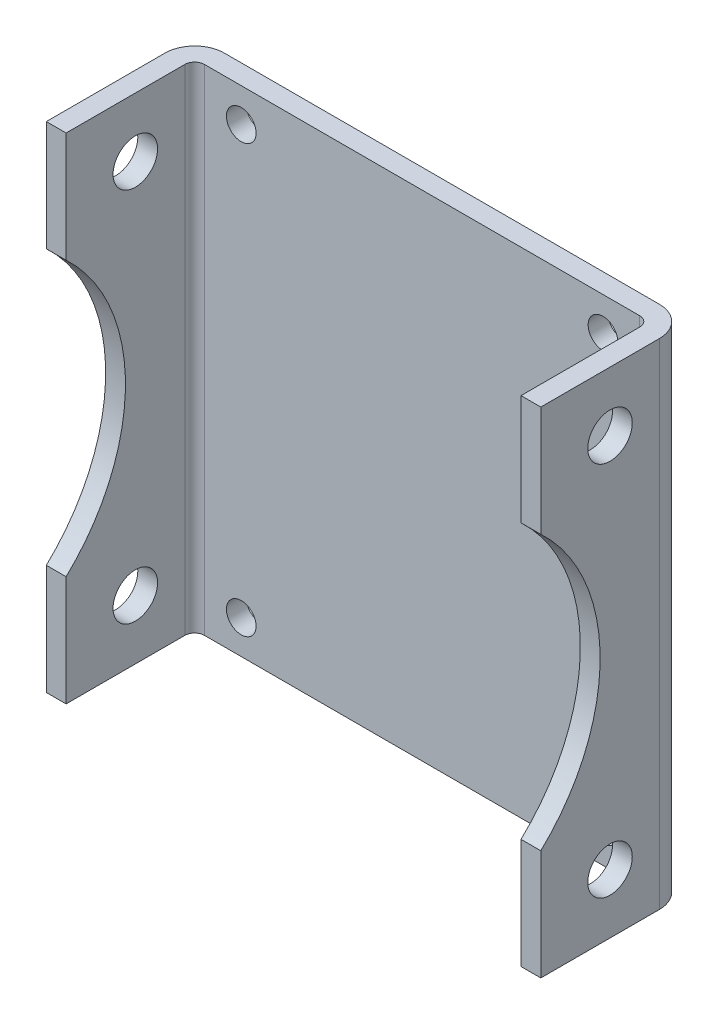
ISO-10303-21;
HEADER;
FILE_DESCRIPTION(('STEP AP214'),'2;1');
FILE_NAME('part.step','',(''),(''),'','','');
FILE_SCHEMA(('AUTOMOTIVE_DESIGN { 1 0 10303 214 1 1 1 1 }'));
ENDSEC;
DATA;
#1=APPLICATION_CONTEXT('core data for automotive mechanical design processes');
#2=APPLICATION_PROTOCOL_DEFINITION('international standard','automotive_design',2000,#1);
#3=PRODUCT_CONTEXT('',#1,'mechanical');
#4=PRODUCT('Part','Part','',(#3));
#5=PRODUCT_RELATED_PRODUCT_CATEGORY('part','',(#4));
#6=PRODUCT_DEFINITION_FORMATION('','',#4);
#7=PRODUCT_DEFINITION_CONTEXT('part definition',#1,'design');
#8=PRODUCT_DEFINITION('design','',#6,#7);
#9=PRODUCT_DEFINITION_SHAPE('','',#8);
#10=(LENGTH_UNIT() NAMED_UNIT(*) SI_UNIT(.MILLI.,.METRE.));
#11=(NAMED_UNIT(*) PLANE_ANGLE_UNIT() SI_UNIT($,.RADIAN.));
#12=(NAMED_UNIT(*) SI_UNIT($,.STERADIAN.) SOLID_ANGLE_UNIT());
#13=UNCERTAINTY_MEASURE_WITH_UNIT(LENGTH_MEASURE(1.E-05),#10,'distance_accuracy_value','');
#14=(GEOMETRIC_REPRESENTATION_CONTEXT(3) GLOBAL_UNCERTAINTY_ASSIGNED_CONTEXT((#13)) GLOBAL_UNIT_ASSIGNED_CONTEXT((#10,
#11,#12)) REPRESENTATION_CONTEXT('',''));
#15=CARTESIAN_POINT('',(0.,0.,0.));
#16=DIRECTION('',(0.,0.,1.));
#17=DIRECTION('',(1.,0.,0.));
#18=AXIS2_PLACEMENT_3D('',#15,#16,#17);
#19=CARTESIAN_POINT('',(0.,50.,0.));
#20=DIRECTION('',(0.,0.,-1.));
#21=DIRECTION('',(-1.,0.,0.));
#22=AXIS2_PLACEMENT_3D('',#19,#20,#21);
#23=PLANE('',#22);
#24=DIRECTION('',(0.,-1.,0.));
#25=VECTOR('',#24,1.);
#26=CARTESIAN_POINT('',(-2.,50.,0.));
#27=LINE('',#26,#25);
#28=CARTESIAN_POINT('',(-2.,50.,0.));
#29=VERTEX_POINT('',#28);
#30=CARTESIAN_POINT('',(-2.,38.856406460551,0.));
#31=VERTEX_POINT('',#30);
#32=EDGE_CURVE('E162',#29,#31,#27,.T.);
#33=ORIENTED_EDGE('',*,*,#32,.T.);
#34=DIRECTION('',(1.,0.,0.));
#35=VECTOR('',#34,1.);
#36=CARTESIAN_POINT('',(-2.00000000000002,38.856406460551,0.));
#37=LINE('',#36,#35);
#38=CARTESIAN_POINT('',(0.,38.856406460551,0.));
#39=VERTEX_POINT('',#38);
#40=EDGE_CURVE('E55',#31,#39,#37,.T.);
#41=ORIENTED_EDGE('',*,*,#40,.T.);
#42=DIRECTION('',(0.,-1.,0.));
#43=VECTOR('',#42,1.);
#44=CARTESIAN_POINT('',(0.,50.,0.));
#45=LINE('',#44,#43);
#46=CARTESIAN_POINT('',(0.,50.,0.));
#47=VERTEX_POINT('',#46);
#48=EDGE_CURVE('E40',#47,#39,#45,.T.);
#49=ORIENTED_EDGE('',*,*,#48,.F.);
#50=DIRECTION('',(1.,0.,0.));
#51=VECTOR('',#50,1.);
#52=CARTESIAN_POINT('',(0.,50.,0.));
#53=LINE('',#52,#51);
#54=EDGE_CURVE('E241',#29,#47,#53,.T.);
#55=ORIENTED_EDGE('',*,*,#54,.F.);
#56=EDGE_LOOP('',(#33,#41,#49,#55));
#57=FACE_BOUND('',#56,.T.);
#58=ADVANCED_FACE('F32',(#57),#23,.F.);
#59=CARTESIAN_POINT('',(48.,50.,0.));
#60=DIRECTION('',(0.,0.,-1.));
#61=DIRECTION('',(-1.,0.,0.));
#62=AXIS2_PLACEMENT_3D('',#59,#60,#61);
#63=PLANE('',#62);
#64=DIRECTION('',(0.,-1.,0.));
#65=VECTOR('',#64,1.);
#66=CARTESIAN_POINT('',(46.,50.,0.));
#67=LINE('',#66,#65);
#68=CARTESIAN_POINT('',(46.,50.,0.));
#69=VERTEX_POINT('',#68);
#70=CARTESIAN_POINT('',(46.,38.856406460551,0.));
#71=VERTEX_POINT('',#70);
#72=EDGE_CURVE('E186',#69,#71,#67,.T.);
#73=ORIENTED_EDGE('',*,*,#72,.T.);
#74=DIRECTION('',(1.,0.,0.));
#75=VECTOR('',#74,1.);
#76=CARTESIAN_POINT('',(-2.00000000000002,38.856406460551,0.));
#77=LINE('',#76,#75);
#78=CARTESIAN_POINT('',(48.,38.856406460551,0.));
#79=VERTEX_POINT('',#78);
#80=EDGE_CURVE('E372',#71,#79,#77,.T.);
#81=ORIENTED_EDGE('',*,*,#80,.T.);
#82=DIRECTION('',(0.,-1.,0.));
#83=VECTOR('',#82,1.);
#84=CARTESIAN_POINT('',(48.,50.,0.));
#85=LINE('',#84,#83);
#86=CARTESIAN_POINT('',(48.,50.,0.));
#87=VERTEX_POINT('',#86);
#88=EDGE_CURVE('E182',#87,#79,#85,.T.);
#89=ORIENTED_EDGE('',*,*,#88,.F.);
#90=DIRECTION('',(1.,0.,0.));
#91=VECTOR('',#90,1.);
#92=CARTESIAN_POINT('',(48.,50.,0.));
#93=LINE('',#92,#91);
#94=EDGE_CURVE('E258',#69,#87,#93,.T.);
#95=ORIENTED_EDGE('',*,*,#94,.F.);
#96=EDGE_LOOP('',(#73,#81,#89,#95));
#97=FACE_BOUND('',#96,.T.);
#98=ADVANCED_FACE('F309',(#97),#63,.F.);
#99=CARTESIAN_POINT('',(0.,11.143593539449,0.));
#100=VERTEX_POINT('',#99);
#101=CARTESIAN_POINT('',(0.,0.,0.));
#102=VERTEX_POINT('',#101);
#103=EDGE_CURVE('E154',#100,#102,#45,.T.);
#104=ORIENTED_EDGE('',*,*,#103,.F.);
#105=DIRECTION('',(1.,0.,0.));
#106=VECTOR('',#105,1.);
#107=CARTESIAN_POINT('',(-2.00000000000002,11.143593539449,0.));
#108=LINE('',#107,#106);
#109=CARTESIAN_POINT('',(-2.00000000000002,11.143593539449,0.));
#110=VERTEX_POINT('',#109);
#111=EDGE_CURVE('E143',#100,#110,#108,.F.);
#112=ORIENTED_EDGE('',*,*,#111,.T.);
#113=CARTESIAN_POINT('',(-2.,0.,0.));
#114=VERTEX_POINT('',#113);
#115=EDGE_CURVE('E152',#110,#114,#27,.T.);
#116=ORIENTED_EDGE('',*,*,#115,.T.);
#117=DIRECTION('',(1.,0.,0.));
#118=VECTOR('',#117,1.);
#119=CARTESIAN_POINT('',(0.,0.,0.));
#120=LINE('',#119,#118);
#121=EDGE_CURVE('E210',#114,#102,#120,.T.);
#122=ORIENTED_EDGE('',*,*,#121,.T.);
#123=EDGE_LOOP('',(#104,#112,#116,#122));
#124=FACE_BOUND('',#123,.T.);
#125=ADVANCED_FACE('F34',(#124),#23,.F.);
#126=CARTESIAN_POINT('',(0.,50.,-12.));
#127=DIRECTION('',(-1.,0.,0.));
#128=DIRECTION('',(0.,0.,1.));
#129=AXIS2_PLACEMENT_3D('',#126,#127,#128);
#130=PLANE('',#129);
#131=CARTESIAN_POINT('',(0.,6.,-7.00000000000003));
#132=DIRECTION('',(-1.,0.,0.));
#133=DIRECTION('',(0.,0.,1.));
#134=AXIS2_PLACEMENT_3D('',#131,#132,#133);
#135=CIRCLE('',#134,2.25);
#136=CARTESIAN_POINT('',(0.,6.,-4.75000000000003));
#137=VERTEX_POINT('',#136);
#138=EDGE_CURVE('E214',#137,#137,#135,.T.);
#139=ORIENTED_EDGE('',*,*,#138,.T.);
#140=EDGE_LOOP('',(#139));
#141=FACE_BOUND('',#140,.T.);
#142=CARTESIAN_POINT('',(0.,44.,-7.00000000000002));
#143=DIRECTION('',(-1.,0.,0.));
#144=DIRECTION('',(0.,0.,1.));
#145=AXIS2_PLACEMENT_3D('',#142,#143,#144);
#146=CIRCLE('',#145,2.25);
#147=CARTESIAN_POINT('',(0.,44.,-4.75000000000002));
#148=VERTEX_POINT('',#147);
#149=EDGE_CURVE('E275',#148,#148,#146,.T.);
#150=ORIENTED_EDGE('',*,*,#149,.T.);
#151=EDGE_LOOP('',(#150));
#152=FACE_BOUND('',#151,.T.);
#153=ORIENTED_EDGE('',*,*,#48,.T.);
#154=CARTESIAN_POINT('',(0.,25.,13.));
#155=DIRECTION('',(-1.,0.,0.));
#156=DIRECTION('',(0.,0.,1.));
#157=AXIS2_PLACEMENT_3D('',#154,#155,#156);
#158=CIRCLE('',#157,19.);
#159=EDGE_CURVE('E155',#39,#100,#158,.T.);
#160=ORIENTED_EDGE('',*,*,#159,.T.);
#161=ORIENTED_EDGE('',*,*,#103,.T.);
#162=DIRECTION('',(0.,0.,-1.));
#163=VECTOR('',#162,1.);
#164=CARTESIAN_POINT('',(0.,0.,-12.));
#165=LINE('',#164,#163);
#166=CARTESIAN_POINT('',(0.,0.,-12.));
#167=VERTEX_POINT('',#166);
#168=EDGE_CURVE('E206',#102,#167,#165,.T.);
#169=ORIENTED_EDGE('',*,*,#168,.T.);
#170=DIRECTION('',(0.,-1.,0.));
#171=VECTOR('',#170,1.);
#172=CARTESIAN_POINT('',(0.,50.,-12.));
#173=LINE('',#172,#171);
#174=CARTESIAN_POINT('',(0.,50.,-12.));
#175=VERTEX_POINT('',#174);
#176=EDGE_CURVE('E198',#175,#167,#173,.T.);
#177=ORIENTED_EDGE('',*,*,#176,.F.);
#178=DIRECTION('',(0.,0.,-1.));
#179=VECTOR('',#178,1.);
#180=CARTESIAN_POINT('',(0.,50.,-12.));
#181=LINE('',#180,#179);
#182=EDGE_CURVE('E243',#47,#175,#181,.T.);
#183=ORIENTED_EDGE('',*,*,#182,.F.);
#184=EDGE_LOOP('',(#153,#160,#161,#169,#177,#183));
#185=FACE_BOUND('',#184,.T.);
#186=ADVANCED_FACE('F204',(#141,#152,#185),#130,.F.);
#187=CARTESIAN_POINT('',(1.,50.,-12.));
#188=DIRECTION('',(0.,-1.,0.));
#189=DIRECTION('',(0.,0.,-1.));
#190=AXIS2_PLACEMENT_3D('',#187,#188,#189);
#191=CYLINDRICAL_SURFACE('',#190,1.);
#192=CARTESIAN_POINT('',(1.,0.,-12.));
#193=DIRECTION('',(0.,-1.,0.));
#194=DIRECTION('',(0.,0.,1.));
#195=AXIS2_PLACEMENT_3D('',#192,#193,#194);
#196=CIRCLE('',#195,1.);
#197=CARTESIAN_POINT('',(1.,0.,-13.));
#198=VERTEX_POINT('',#197);
#199=EDGE_CURVE('E212',#167,#198,#196,.T.);
#200=ORIENTED_EDGE('',*,*,#199,.T.);
#201=DIRECTION('',(0.,-1.,0.));
#202=VECTOR('',#201,1.);
#203=CARTESIAN_POINT('',(1.,50.,-13.));
#204=LINE('',#203,#202);
#205=CARTESIAN_POINT('',(1.,50.,-13.));
#206=VERTEX_POINT('',#205);
#207=EDGE_CURVE('E195',#206,#198,#204,.T.);
#208=ORIENTED_EDGE('',*,*,#207,.F.);
#209=CARTESIAN_POINT('',(1.,50.,-12.));
#210=DIRECTION('',(0.,-1.,0.));
#211=DIRECTION('',(0.,0.,1.));
#212=AXIS2_PLACEMENT_3D('',#209,#210,#211);
#213=CIRCLE('',#212,1.);
#214=EDGE_CURVE('E247',#175,#206,#213,.T.);
#215=ORIENTED_EDGE('',*,*,#214,.F.);
#216=ORIENTED_EDGE('',*,*,#176,.T.);
#217=EDGE_LOOP('',(#200,#208,#215,#216));
#218=FACE_BOUND('',#217,.T.);
#219=ADVANCED_FACE('F320',(#218),#191,.F.);
#220=CARTESIAN_POINT('',(45.,50.,-13.));
#221=DIRECTION('',(0.,0.,-1.));
#222=DIRECTION('',(-1.,0.,0.));
#223=AXIS2_PLACEMENT_3D('',#220,#221,#222);
#224=PLANE('',#223);
#225=CARTESIAN_POINT('',(41.29,3.41,-13.));
#226=DIRECTION('',(0.,0.,-1.));
#227=DIRECTION('',(-1.,0.,0.));
#228=AXIS2_PLACEMENT_3D('',#225,#226,#227);
#229=CIRCLE('',#228,1.5);
#230=CARTESIAN_POINT('',(39.79,3.41,-13.));
#231=VERTEX_POINT('',#230);
#232=EDGE_CURVE('E402',#231,#231,#229,.T.);
#233=ORIENTED_EDGE('',*,*,#232,.T.);
#234=EDGE_LOOP('',(#233));
#235=FACE_BOUND('',#234,.T.);
#236=CARTESIAN_POINT('',(4.71,3.41,-13.));
#237=DIRECTION('',(0.,0.,-1.));
#238=DIRECTION('',(-1.,0.,0.));
#239=AXIS2_PLACEMENT_3D('',#236,#237,#238);
#240=CIRCLE('',#239,1.5);
#241=CARTESIAN_POINT('',(3.21,3.41,-13.));
#242=VERTEX_POINT('',#241);
#243=EDGE_CURVE('E412',#242,#242,#240,.T.);
#244=ORIENTED_EDGE('',*,*,#243,.T.);
#245=EDGE_LOOP('',(#244));
#246=FACE_BOUND('',#245,.T.);
#247=CARTESIAN_POINT('',(4.71,46.59,-13.));
#248=DIRECTION('',(0.,0.,-1.));
#249=DIRECTION('',(-1.,0.,0.));
#250=AXIS2_PLACEMENT_3D('',#247,#248,#249);
#251=CIRCLE('',#250,1.5);
#252=CARTESIAN_POINT('',(3.21,46.59,-13.));
#253=VERTEX_POINT('',#252);
#254=EDGE_CURVE('E415',#253,#253,#251,.T.);
#255=ORIENTED_EDGE('',*,*,#254,.T.);
#256=EDGE_LOOP('',(#255));
#257=FACE_BOUND('',#256,.T.);
#258=CARTESIAN_POINT('',(41.29,46.59,-13.));
#259=DIRECTION('',(0.,0.,-1.));
#260=DIRECTION('',(-1.,0.,0.));
#261=AXIS2_PLACEMENT_3D('',#258,#259,#260);
#262=CIRCLE('',#261,1.5);
#263=CARTESIAN_POINT('',(39.79,46.59,-13.));
#264=VERTEX_POINT('',#263);
#265=EDGE_CURVE('E418',#264,#264,#262,.T.);
#266=ORIENTED_EDGE('',*,*,#265,.T.);
#267=EDGE_LOOP('',(#266));
#268=FACE_BOUND('',#267,.T.);
#269=DIRECTION('',(1.,0.,0.));
#270=VECTOR('',#269,1.);
#271=CARTESIAN_POINT('',(45.,0.,-13.));
#272=LINE('',#271,#270);
#273=CARTESIAN_POINT('',(45.,0.,-13.));
#274=VERTEX_POINT('',#273);
#275=EDGE_CURVE('E222',#198,#274,#272,.T.);
#276=ORIENTED_EDGE('',*,*,#275,.T.);
#277=DIRECTION('',(0.,-1.,0.));
#278=VECTOR('',#277,1.);
#279=CARTESIAN_POINT('',(45.,50.,-13.));
#280=LINE('',#279,#278);
#281=CARTESIAN_POINT('',(45.,50.,-13.));
#282=VERTEX_POINT('',#281);
#283=EDGE_CURVE('E192',#282,#274,#280,.T.);
#284=ORIENTED_EDGE('',*,*,#283,.F.);
#285=DIRECTION('',(1.,0.,0.));
#286=VECTOR('',#285,1.);
#287=CARTESIAN_POINT('',(45.,50.,-13.));
#288=LINE('',#287,#286);
#289=EDGE_CURVE('E252',#206,#282,#288,.T.);
#290=ORIENTED_EDGE('',*,*,#289,.F.);
#291=ORIENTED_EDGE('',*,*,#207,.T.);
#292=EDGE_LOOP('',(#276,#284,#290,#291));
#293=FACE_BOUND('',#292,.T.);
#294=ADVANCED_FACE('F325',(#235,#246,#257,#268,#293),#224,.F.);
#295=CARTESIAN_POINT('',(45.,50.,-12.));
#296=DIRECTION('',(0.,-1.,0.));
#297=DIRECTION('',(0.,0.,-1.));
#298=AXIS2_PLACEMENT_3D('',#295,#296,#297);
#299=CYLINDRICAL_SURFACE('',#298,1.);
#300=CARTESIAN_POINT('',(45.,0.,-12.));
#301=DIRECTION('',(0.,-1.,0.));
#302=DIRECTION('',(0.,0.,1.));
#303=AXIS2_PLACEMENT_3D('',#300,#301,#302);
#304=CIRCLE('',#303,1.);
#305=CARTESIAN_POINT('',(46.,0.,-12.));
#306=VERTEX_POINT('',#305);
#307=EDGE_CURVE('E224',#274,#306,#304,.T.);
#308=ORIENTED_EDGE('',*,*,#307,.T.);
#309=DIRECTION('',(0.,-1.,0.));
#310=VECTOR('',#309,1.);
#311=CARTESIAN_POINT('',(46.,50.,-12.));
#312=LINE('',#311,#310);
#313=CARTESIAN_POINT('',(46.,50.,-12.));
#314=VERTEX_POINT('',#313);
#315=EDGE_CURVE('E189',#314,#306,#312,.T.);
#316=ORIENTED_EDGE('',*,*,#315,.F.);
#317=CARTESIAN_POINT('',(45.,50.,-12.));
#318=DIRECTION('',(0.,-1.,0.));
#319=DIRECTION('',(0.,0.,1.));
#320=AXIS2_PLACEMENT_3D('',#317,#318,#319);
#321=CIRCLE('',#320,1.);
#322=EDGE_CURVE('E254',#282,#314,#321,.T.);
#323=ORIENTED_EDGE('',*,*,#322,.F.);
#324=ORIENTED_EDGE('',*,*,#283,.T.);
#325=EDGE_LOOP('',(#308,#316,#323,#324));
#326=FACE_BOUND('',#325,.T.);
#327=ADVANCED_FACE('F332',(#326),#299,.F.);
#328=CARTESIAN_POINT('',(46.,50.,0.));
#329=DIRECTION('',(1.,0.,0.));
#330=DIRECTION('',(0.,0.,-1.));
#331=AXIS2_PLACEMENT_3D('',#328,#329,#330);
#332=PLANE('',#331);
#333=CARTESIAN_POINT('',(46.,6.,-7.));
#334=DIRECTION('',(1.,0.,0.));
#335=DIRECTION('',(0.,0.,-1.));
#336=AXIS2_PLACEMENT_3D('',#333,#334,#335);
#337=CIRCLE('',#336,2.25);
#338=CARTESIAN_POINT('',(46.,6.,-9.25000000000001));
#339=VERTEX_POINT('',#338);
#340=EDGE_CURVE('E217',#339,#339,#337,.T.);
#341=ORIENTED_EDGE('',*,*,#340,.T.);
#342=EDGE_LOOP('',(#341));
#343=FACE_BOUND('',#342,.T.);
#344=CARTESIAN_POINT('',(46.,44.,-7.));
#345=DIRECTION('',(1.,0.,0.));
#346=DIRECTION('',(0.,0.,-1.));
#347=AXIS2_PLACEMENT_3D('',#344,#345,#346);
#348=CIRCLE('',#347,2.25);
#349=CARTESIAN_POINT('',(46.,44.,-9.25));
#350=VERTEX_POINT('',#349);
#351=EDGE_CURVE('E272',#350,#350,#348,.T.);
#352=ORIENTED_EDGE('',*,*,#351,.T.);
#353=EDGE_LOOP('',(#352));
#354=FACE_BOUND('',#353,.T.);
#355=CARTESIAN_POINT('',(46.,11.143593539449,0.));
#356=VERTEX_POINT('',#355);
#357=CARTESIAN_POINT('',(46.,0.,0.));
#358=VERTEX_POINT('',#357);
#359=EDGE_CURVE('E185',#356,#358,#67,.T.);
#360=ORIENTED_EDGE('',*,*,#359,.F.);
#361=CARTESIAN_POINT('',(46.,25.,13.));
#362=DIRECTION('',(1.,0.,0.));
#363=DIRECTION('',(0.,0.,-1.));
#364=AXIS2_PLACEMENT_3D('',#361,#362,#363);
#365=CIRCLE('',#364,19.);
#366=EDGE_CURVE('E370',#356,#71,#365,.T.);
#367=ORIENTED_EDGE('',*,*,#366,.T.);
#368=ORIENTED_EDGE('',*,*,#72,.F.);
#369=DIRECTION('',(0.,0.,1.));
#370=VECTOR('',#369,1.);
#371=CARTESIAN_POINT('',(46.,50.,0.));
#372=LINE('',#371,#370);
#373=EDGE_CURVE('E256',#314,#69,#372,.T.);
#374=ORIENTED_EDGE('',*,*,#373,.F.);
#375=ORIENTED_EDGE('',*,*,#315,.T.);
#376=DIRECTION('',(0.,0.,1.));
#377=VECTOR('',#376,1.);
#378=CARTESIAN_POINT('',(46.,0.,0.));
#379=LINE('',#378,#377);
#380=EDGE_CURVE('E226',#306,#358,#379,.T.);
#381=ORIENTED_EDGE('',*,*,#380,.T.);
#382=EDGE_LOOP('',(#360,#367,#368,#374,#375,#381));
#383=FACE_BOUND('',#382,.T.);
#384=ADVANCED_FACE('F283',(#343,#354,#383),#332,.F.);
#385=CARTESIAN_POINT('',(48.,11.143593539449,0.));
#386=VERTEX_POINT('',#385);
#387=CARTESIAN_POINT('',(48.,0.,0.));
#388=VERTEX_POINT('',#387);
#389=EDGE_CURVE('E181',#386,#388,#85,.T.);
#390=ORIENTED_EDGE('',*,*,#389,.F.);
#391=DIRECTION('',(1.,0.,0.));
#392=VECTOR('',#391,1.);
#393=CARTESIAN_POINT('',(-2.00000000000002,11.143593539449,0.));
#394=LINE('',#393,#392);
#395=EDGE_CURVE('E47',#386,#356,#394,.F.);
#396=ORIENTED_EDGE('',*,*,#395,.T.);
#397=ORIENTED_EDGE('',*,*,#359,.T.);
#398=DIRECTION('',(1.,0.,0.));
#399=VECTOR('',#398,1.);
#400=CARTESIAN_POINT('',(48.,0.,0.));
#401=LINE('',#400,#399);
#402=EDGE_CURVE('E229',#358,#388,#401,.T.);
#403=ORIENTED_EDGE('',*,*,#402,.T.);
#404=EDGE_LOOP('',(#390,#396,#397,#403));
#405=FACE_BOUND('',#404,.T.);
#406=ADVANCED_FACE('F315',(#405),#63,.F.);
#407=CARTESIAN_POINT('',(48.,50.,-12.));
#408=DIRECTION('',(-1.,0.,0.));
#409=DIRECTION('',(0.,0.,1.));
#410=AXIS2_PLACEMENT_3D('',#407,#408,#409);
#411=PLANE('',#410);
#412=CARTESIAN_POINT('',(48.,6.,-7.));
#413=DIRECTION('',(1.,0.,0.));
#414=DIRECTION('',(0.,0.,-1.));
#415=AXIS2_PLACEMENT_3D('',#412,#413,#414);
#416=CIRCLE('',#415,2.25);
#417=CARTESIAN_POINT('',(48.,6.,-9.25));
#418=VERTEX_POINT('',#417);
#419=EDGE_CURVE('E399',#418,#418,#416,.T.);
#420=ORIENTED_EDGE('',*,*,#419,.F.);
#421=EDGE_LOOP('',(#420));
#422=FACE_BOUND('',#421,.T.);
#423=CARTESIAN_POINT('',(48.,44.,-7.));
#424=DIRECTION('',(1.,0.,0.));
#425=DIRECTION('',(0.,0.,-1.));
#426=AXIS2_PLACEMENT_3D('',#423,#424,#425);
#427=CIRCLE('',#426,2.25);
#428=CARTESIAN_POINT('',(48.,44.,-9.25));
#429=VERTEX_POINT('',#428);
#430=EDGE_CURVE('E405',#429,#429,#427,.T.);
#431=ORIENTED_EDGE('',*,*,#430,.F.);
#432=EDGE_LOOP('',(#431));
#433=FACE_BOUND('',#432,.T.);
#434=ORIENTED_EDGE('',*,*,#88,.T.);
#435=CARTESIAN_POINT('',(48.,25.,13.));
#436=DIRECTION('',(1.,0.,0.));
#437=DIRECTION('',(0.,0.,-1.));
#438=AXIS2_PLACEMENT_3D('',#435,#436,#437);
#439=CIRCLE('',#438,19.);
#440=EDGE_CURVE('E378',#386,#79,#439,.T.);
#441=ORIENTED_EDGE('',*,*,#440,.F.);
#442=ORIENTED_EDGE('',*,*,#389,.T.);
#443=DIRECTION('',(0.,0.,-1.));
#444=VECTOR('',#443,1.);
#445=CARTESIAN_POINT('',(48.,0.,-12.));
#446=LINE('',#445,#444);
#447=CARTESIAN_POINT('',(48.,0.,-12.));
#448=VERTEX_POINT('',#447);
#449=EDGE_CURVE('E232',#388,#448,#446,.T.);
#450=ORIENTED_EDGE('',*,*,#449,.T.);
#451=DIRECTION('',(0.,-1.,0.));
#452=VECTOR('',#451,1.);
#453=CARTESIAN_POINT('',(48.,50.,-12.));
#454=LINE('',#453,#452);
#455=CARTESIAN_POINT('',(48.,50.,-12.));
#456=VERTEX_POINT('',#455);
#457=EDGE_CURVE('E178',#456,#448,#454,.T.);
#458=ORIENTED_EDGE('',*,*,#457,.F.);
#459=DIRECTION('',(0.,0.,-1.));
#460=VECTOR('',#459,1.);
#461=CARTESIAN_POINT('',(48.,50.,-12.));
#462=LINE('',#461,#460);
#463=EDGE_CURVE('E260',#87,#456,#462,.T.);
#464=ORIENTED_EDGE('',*,*,#463,.F.);
#465=EDGE_LOOP('',(#434,#441,#442,#450,#458,#464));
#466=FACE_BOUND('',#465,.T.);
#467=ADVANCED_FACE('F340',(#422,#433,#466),#411,.F.);
#468=CARTESIAN_POINT('',(45.,50.,-12.));
#469=DIRECTION('',(0.,-1.,0.));
#470=DIRECTION('',(0.,0.,-1.));
#471=AXIS2_PLACEMENT_3D('',#468,#469,#470);
#472=CYLINDRICAL_SURFACE('',#471,3.);
#473=CARTESIAN_POINT('',(45.,0.,-12.));
#474=DIRECTION('',(0.,1.,0.));
#475=DIRECTION('',(0.,0.,-1.));
#476=AXIS2_PLACEMENT_3D('',#473,#474,#475);
#477=CIRCLE('',#476,3.);
#478=CARTESIAN_POINT('',(45.,0.,-15.));
#479=VERTEX_POINT('',#478);
#480=EDGE_CURVE('E234',#448,#479,#477,.T.);
#481=ORIENTED_EDGE('',*,*,#480,.T.);
#482=DIRECTION('',(0.,-1.,0.));
#483=VECTOR('',#482,1.);
#484=CARTESIAN_POINT('',(45.,50.,-15.));
#485=LINE('',#484,#483);
#486=CARTESIAN_POINT('',(45.,50.,-15.));
#487=VERTEX_POINT('',#486);
#488=EDGE_CURVE('E175',#487,#479,#485,.T.);
#489=ORIENTED_EDGE('',*,*,#488,.F.);
#490=CARTESIAN_POINT('',(45.,50.,-12.));
#491=DIRECTION('',(0.,1.,0.));
#492=DIRECTION('',(0.,0.,-1.));
#493=AXIS2_PLACEMENT_3D('',#490,#491,#492);
#494=CIRCLE('',#493,3.);
#495=EDGE_CURVE('E262',#456,#487,#494,.T.);
#496=ORIENTED_EDGE('',*,*,#495,.F.);
#497=ORIENTED_EDGE('',*,*,#457,.T.);
#498=EDGE_LOOP('',(#481,#489,#496,#497));
#499=FACE_BOUND('',#498,.T.);
#500=ADVANCED_FACE('F344',(#499),#472,.T.);
#501=CARTESIAN_POINT('',(0.999999999999999,50.,-15.));
#502=DIRECTION('',(0.,0.,1.));
#503=DIRECTION('',(1.,0.,0.));
#504=AXIS2_PLACEMENT_3D('',#501,#502,#503);
#505=PLANE('',#504);
#506=CARTESIAN_POINT('',(41.29,3.41,-15.));
#507=DIRECTION('',(0.,0.,-1.));
#508=DIRECTION('',(-1.,0.,0.));
#509=AXIS2_PLACEMENT_3D('',#506,#507,#508);
#510=CIRCLE('',#509,1.5);
#511=CARTESIAN_POINT('',(39.79,3.41,-15.));
#512=VERTEX_POINT('',#511);
#513=EDGE_CURVE('E425',#512,#512,#510,.T.);
#514=ORIENTED_EDGE('',*,*,#513,.F.);
#515=EDGE_LOOP('',(#514));
#516=FACE_BOUND('',#515,.T.);
#517=CARTESIAN_POINT('',(4.71,3.41,-15.));
#518=DIRECTION('',(0.,0.,-1.));
#519=DIRECTION('',(-1.,0.,0.));
#520=AXIS2_PLACEMENT_3D('',#517,#518,#519);
#521=CIRCLE('',#520,1.5);
#522=CARTESIAN_POINT('',(3.21,3.41,-15.));
#523=VERTEX_POINT('',#522);
#524=EDGE_CURVE('E428',#523,#523,#521,.T.);
#525=ORIENTED_EDGE('',*,*,#524,.F.);
#526=EDGE_LOOP('',(#525));
#527=FACE_BOUND('',#526,.T.);
#528=CARTESIAN_POINT('',(4.71,46.59,-15.));
#529=DIRECTION('',(0.,0.,-1.));
#530=DIRECTION('',(-1.,0.,0.));
#531=AXIS2_PLACEMENT_3D('',#528,#529,#530);
#532=CIRCLE('',#531,1.5);
#533=CARTESIAN_POINT('',(3.21,46.59,-15.));
#534=VERTEX_POINT('',#533);
#535=EDGE_CURVE('E424',#534,#534,#532,.T.);
#536=ORIENTED_EDGE('',*,*,#535,.F.);
#537=EDGE_LOOP('',(#536));
#538=FACE_BOUND('',#537,.T.);
#539=CARTESIAN_POINT('',(41.29,46.59,-15.));
#540=DIRECTION('',(0.,0.,-1.));
#541=DIRECTION('',(-1.,0.,0.));
#542=AXIS2_PLACEMENT_3D('',#539,#540,#541);
#543=CIRCLE('',#542,1.5);
#544=CARTESIAN_POINT('',(39.79,46.59,-15.));
#545=VERTEX_POINT('',#544);
#546=EDGE_CURVE('E421',#545,#545,#543,.T.);
#547=ORIENTED_EDGE('',*,*,#546,.F.);
#548=EDGE_LOOP('',(#547));
#549=FACE_BOUND('',#548,.T.);
#550=DIRECTION('',(-1.,0.,0.));
#551=VECTOR('',#550,1.);
#552=CARTESIAN_POINT('',(0.999999999999999,0.,-15.));
#553=LINE('',#552,#551);
#554=CARTESIAN_POINT('',(0.999999999999999,0.,-15.));
#555=VERTEX_POINT('',#554);
#556=EDGE_CURVE('E236',#479,#555,#553,.T.);
#557=ORIENTED_EDGE('',*,*,#556,.T.);
#558=DIRECTION('',(0.,-1.,0.));
#559=VECTOR('',#558,1.);
#560=CARTESIAN_POINT('',(0.999999999999999,50.,-15.));
#561=LINE('',#560,#559);
#562=CARTESIAN_POINT('',(0.999999999999999,50.,-15.));
#563=VERTEX_POINT('',#562);
#564=EDGE_CURVE('E172',#563,#555,#561,.T.);
#565=ORIENTED_EDGE('',*,*,#564,.F.);
#566=DIRECTION('',(-1.,0.,0.));
#567=VECTOR('',#566,1.);
#568=CARTESIAN_POINT('',(0.999999999999999,50.,-15.));
#569=LINE('',#568,#567);
#570=EDGE_CURVE('E264',#487,#563,#569,.T.);
#571=ORIENTED_EDGE('',*,*,#570,.F.);
#572=ORIENTED_EDGE('',*,*,#488,.T.);
#573=EDGE_LOOP('',(#557,#565,#571,#572));
#574=FACE_BOUND('',#573,.T.);
#575=ADVANCED_FACE('F348',(#516,#527,#538,#549,#574),#505,.F.);
#576=CARTESIAN_POINT('',(0.999999999999999,50.,-12.));
#577=DIRECTION('',(0.,-1.,0.));
#578=DIRECTION('',(0.,0.,-1.));
#579=AXIS2_PLACEMENT_3D('',#576,#577,#578);
#580=CYLINDRICAL_SURFACE('',#579,3.);
#581=CARTESIAN_POINT('',(0.999999999999999,0.,-12.));
#582=DIRECTION('',(0.,1.,0.));
#583=DIRECTION('',(0.,0.,-1.));
#584=AXIS2_PLACEMENT_3D('',#581,#582,#583);
#585=CIRCLE('',#584,3.);
#586=CARTESIAN_POINT('',(-2.,0.,-12.));
#587=VERTEX_POINT('',#586);
#588=EDGE_CURVE('E237',#555,#587,#585,.T.);
#589=ORIENTED_EDGE('',*,*,#588,.T.);
#590=DIRECTION('',(0.,-1.,0.));
#591=VECTOR('',#590,1.);
#592=CARTESIAN_POINT('',(-2.,50.,-12.));
#593=LINE('',#592,#591);
#594=CARTESIAN_POINT('',(-2.,50.,-12.));
#595=VERTEX_POINT('',#594);
#596=EDGE_CURVE('E165',#595,#587,#593,.T.);
#597=ORIENTED_EDGE('',*,*,#596,.F.);
#598=CARTESIAN_POINT('',(0.999999999999999,50.,-12.));
#599=DIRECTION('',(0.,1.,0.));
#600=DIRECTION('',(0.,0.,-1.));
#601=AXIS2_PLACEMENT_3D('',#598,#599,#600);
#602=CIRCLE('',#601,3.);
#603=EDGE_CURVE('E166',#563,#595,#602,.T.);
#604=ORIENTED_EDGE('',*,*,#603,.F.);
#605=ORIENTED_EDGE('',*,*,#564,.T.);
#606=EDGE_LOOP('',(#589,#597,#604,#605));
#607=FACE_BOUND('',#606,.T.);
#608=ADVANCED_FACE('F270',(#607),#580,.T.);
#609=CARTESIAN_POINT('',(-2.,50.,0.));
#610=DIRECTION('',(1.,0.,0.));
#611=DIRECTION('',(0.,0.,-1.));
#612=AXIS2_PLACEMENT_3D('',#609,#610,#611);
#613=PLANE('',#612);
#614=CARTESIAN_POINT('',(-2.00000000000001,6.,-7.00000000000003));
#615=DIRECTION('',(1.,0.,0.));
#616=DIRECTION('',(0.,0.,-1.));
#617=AXIS2_PLACEMENT_3D('',#614,#615,#616);
#618=CIRCLE('',#617,2.25);
#619=CARTESIAN_POINT('',(-2.00000000000001,6.,-9.25000000000003));
#620=VERTEX_POINT('',#619);
#621=EDGE_CURVE('E401',#620,#620,#618,.T.);
#622=ORIENTED_EDGE('',*,*,#621,.T.);
#623=EDGE_LOOP('',(#622));
#624=FACE_BOUND('',#623,.T.);
#625=CARTESIAN_POINT('',(-2.00000000000001,44.,-7.00000000000003));
#626=DIRECTION('',(1.,0.,0.));
#627=DIRECTION('',(0.,0.,-1.));
#628=AXIS2_PLACEMENT_3D('',#625,#626,#627);
#629=CIRCLE('',#628,2.25);
#630=CARTESIAN_POINT('',(-2.00000000000001,44.,-9.25000000000003));
#631=VERTEX_POINT('',#630);
#632=EDGE_CURVE('E398',#631,#631,#629,.T.);
#633=ORIENTED_EDGE('',*,*,#632,.T.);
#634=EDGE_LOOP('',(#633));
#635=FACE_BOUND('',#634,.T.);
#636=ORIENTED_EDGE('',*,*,#115,.F.);
#637=CARTESIAN_POINT('',(-2.,25.,13.));
#638=DIRECTION('',(1.,0.,0.));
#639=DIRECTION('',(0.,0.,-1.));
#640=AXIS2_PLACEMENT_3D('',#637,#638,#639);
#641=CIRCLE('',#640,19.);
#642=EDGE_CURVE('E11',#110,#31,#641,.T.);
#643=ORIENTED_EDGE('',*,*,#642,.T.);
#644=ORIENTED_EDGE('',*,*,#32,.F.);
#645=DIRECTION('',(0.,0.,1.));
#646=VECTOR('',#645,1.);
#647=CARTESIAN_POINT('',(-2.,50.,0.));
#648=LINE('',#647,#646);
#649=EDGE_CURVE('E163',#595,#29,#648,.T.);
#650=ORIENTED_EDGE('',*,*,#649,.F.);
#651=ORIENTED_EDGE('',*,*,#596,.T.);
#652=DIRECTION('',(0.,0.,1.));
#653=VECTOR('',#652,1.);
#654=CARTESIAN_POINT('',(-2.,0.,0.));
#655=LINE('',#654,#653);
#656=EDGE_CURVE('E160',#587,#114,#655,.T.);
#657=ORIENTED_EDGE('',*,*,#656,.T.);
#658=EDGE_LOOP('',(#636,#643,#644,#650,#651,#657));
#659=FACE_BOUND('',#658,.T.);
#660=ADVANCED_FACE('F157',(#624,#635,#659),#613,.F.);
#661=CARTESIAN_POINT('',(0.999999999999999,50.,-12.));
#662=DIRECTION('',(0.,-1.,0.));
#663=DIRECTION('',(0.,0.,-1.));
#664=AXIS2_PLACEMENT_3D('',#661,#662,#663);
#665=PLANE('',#664);
#666=ORIENTED_EDGE('',*,*,#54,.T.);
#667=ORIENTED_EDGE('',*,*,#182,.T.);
#668=ORIENTED_EDGE('',*,*,#214,.T.);
#669=ORIENTED_EDGE('',*,*,#289,.T.);
#670=ORIENTED_EDGE('',*,*,#322,.T.);
#671=ORIENTED_EDGE('',*,*,#373,.T.);
#672=ORIENTED_EDGE('',*,*,#94,.T.);
#673=ORIENTED_EDGE('',*,*,#463,.T.);
#674=ORIENTED_EDGE('',*,*,#495,.T.);
#675=ORIENTED_EDGE('',*,*,#570,.T.);
#676=ORIENTED_EDGE('',*,*,#603,.T.);
#677=ORIENTED_EDGE('',*,*,#649,.T.);
#678=EDGE_LOOP('',(#666,#667,#668,#669,#670,#671,#672,#673,#674,#675,#676,#677));
#679=FACE_BOUND('',#678,.T.);
#680=ADVANCED_FACE('F266',(#679),#665,.F.);
#681=CARTESIAN_POINT('',(0.999999999999999,0.,-12.));
#682=DIRECTION('',(0.,-1.,0.));
#683=DIRECTION('',(0.,0.,-1.));
#684=AXIS2_PLACEMENT_3D('',#681,#682,#683);
#685=PLANE('',#684);
#686=ORIENTED_EDGE('',*,*,#121,.F.);
#687=ORIENTED_EDGE('',*,*,#656,.F.);
#688=ORIENTED_EDGE('',*,*,#588,.F.);
#689=ORIENTED_EDGE('',*,*,#556,.F.);
#690=ORIENTED_EDGE('',*,*,#480,.F.);
#691=ORIENTED_EDGE('',*,*,#449,.F.);
#692=ORIENTED_EDGE('',*,*,#402,.F.);
#693=ORIENTED_EDGE('',*,*,#380,.F.);
#694=ORIENTED_EDGE('',*,*,#307,.F.);
#695=ORIENTED_EDGE('',*,*,#275,.F.);
#696=ORIENTED_EDGE('',*,*,#199,.F.);
#697=ORIENTED_EDGE('',*,*,#168,.F.);
#698=EDGE_LOOP('',(#686,#687,#688,#689,#690,#691,#692,#693,#694,#695,#696,#697));
#699=FACE_BOUND('',#698,.T.);
#700=ADVANCED_FACE('F209',(#699),#685,.T.);
#701=CARTESIAN_POINT('',(-2.00000000000002,25.,13.));
#702=DIRECTION('',(1.,0.,0.));
#703=DIRECTION('',(0.,0.,-1.));
#704=AXIS2_PLACEMENT_3D('',#701,#702,#703);
#705=CYLINDRICAL_SURFACE('',#704,19.);
#706=ORIENTED_EDGE('',*,*,#642,.F.);
#707=ORIENTED_EDGE('',*,*,#111,.F.);
#708=ORIENTED_EDGE('',*,*,#159,.F.);
#709=ORIENTED_EDGE('',*,*,#40,.F.);
#710=EDGE_LOOP('',(#706,#707,#708,#709));
#711=FACE_BOUND('',#710,.T.);
#712=ADVANCED_FACE('F142',(#711),#705,.F.);
#713=CARTESIAN_POINT('',(-2.00000000000001,44.,-7.00000000000003));
#714=DIRECTION('',(1.,0.,0.));
#715=DIRECTION('',(0.,0.,-1.));
#716=AXIS2_PLACEMENT_3D('',#713,#714,#715);
#717=CYLINDRICAL_SURFACE('',#716,2.25);
#718=ORIENTED_EDGE('',*,*,#632,.F.);
#719=EDGE_LOOP('',(#718));
#720=FACE_BOUND('',#719,.T.);
#721=ORIENTED_EDGE('',*,*,#149,.F.);
#722=EDGE_LOOP('',(#721));
#723=FACE_BOUND('',#722,.T.);
#724=ADVANCED_FACE('F303',(#720,#723),#717,.F.);
#725=CARTESIAN_POINT('',(-2.00000000000001,6.,-7.00000000000003));
#726=DIRECTION('',(1.,0.,0.));
#727=DIRECTION('',(0.,0.,-1.));
#728=AXIS2_PLACEMENT_3D('',#725,#726,#727);
#729=CYLINDRICAL_SURFACE('',#728,2.25);
#730=ORIENTED_EDGE('',*,*,#621,.F.);
#731=EDGE_LOOP('',(#730));
#732=FACE_BOUND('',#731,.T.);
#733=ORIENTED_EDGE('',*,*,#138,.F.);
#734=EDGE_LOOP('',(#733));
#735=FACE_BOUND('',#734,.T.);
#736=ADVANCED_FACE('F292',(#732,#735),#729,.F.);
#737=ORIENTED_EDGE('',*,*,#366,.F.);
#738=ORIENTED_EDGE('',*,*,#395,.F.);
#739=ORIENTED_EDGE('',*,*,#440,.T.);
#740=ORIENTED_EDGE('',*,*,#80,.F.);
#741=EDGE_LOOP('',(#737,#738,#739,#740));
#742=FACE_BOUND('',#741,.T.);
#743=ADVANCED_FACE('F300',(#742),#705,.F.);
#744=ORIENTED_EDGE('',*,*,#430,.T.);
#745=EDGE_LOOP('',(#744));
#746=FACE_BOUND('',#745,.T.);
#747=ORIENTED_EDGE('',*,*,#351,.F.);
#748=EDGE_LOOP('',(#747));
#749=FACE_BOUND('',#748,.T.);
#750=ADVANCED_FACE('F289',(#746,#749),#717,.F.);
#751=ORIENTED_EDGE('',*,*,#419,.T.);
#752=EDGE_LOOP('',(#751));
#753=FACE_BOUND('',#752,.T.);
#754=ORIENTED_EDGE('',*,*,#340,.F.);
#755=EDGE_LOOP('',(#754));
#756=FACE_BOUND('',#755,.T.);
#757=ADVANCED_FACE('F286',(#753,#756),#729,.F.);
#758=CARTESIAN_POINT('',(41.29,46.59,-5.));
#759=DIRECTION('',(0.,0.,-1.));
#760=DIRECTION('',(-1.,0.,0.));
#761=AXIS2_PLACEMENT_3D('',#758,#759,#760);
#762=CYLINDRICAL_SURFACE('',#761,1.5);
#763=ORIENTED_EDGE('',*,*,#546,.T.);
#764=EDGE_LOOP('',(#763));
#765=FACE_BOUND('',#764,.T.);
#766=ORIENTED_EDGE('',*,*,#265,.F.);
#767=EDGE_LOOP('',(#766));
#768=FACE_BOUND('',#767,.T.);
#769=ADVANCED_FACE('F288',(#765,#768),#762,.F.);
#770=CARTESIAN_POINT('',(4.71,46.59,-5.));
#771=DIRECTION('',(0.,0.,-1.));
#772=DIRECTION('',(-1.,0.,0.));
#773=AXIS2_PLACEMENT_3D('',#770,#771,#772);
#774=CYLINDRICAL_SURFACE('',#773,1.5);
#775=ORIENTED_EDGE('',*,*,#535,.T.);
#776=EDGE_LOOP('',(#775));
#777=FACE_BOUND('',#776,.T.);
#778=ORIENTED_EDGE('',*,*,#254,.F.);
#779=EDGE_LOOP('',(#778));
#780=FACE_BOUND('',#779,.T.);
#781=ADVANCED_FACE('F297',(#777,#780),#774,.F.);
#782=CARTESIAN_POINT('',(4.71,3.41,-5.));
#783=DIRECTION('',(0.,0.,-1.));
#784=DIRECTION('',(-1.,0.,0.));
#785=AXIS2_PLACEMENT_3D('',#782,#783,#784);
#786=CYLINDRICAL_SURFACE('',#785,1.5);
#787=ORIENTED_EDGE('',*,*,#524,.T.);
#788=EDGE_LOOP('',(#787));
#789=FACE_BOUND('',#788,.T.);
#790=ORIENTED_EDGE('',*,*,#243,.F.);
#791=EDGE_LOOP('',(#790));
#792=FACE_BOUND('',#791,.T.);
#793=ADVANCED_FACE('F449',(#789,#792),#786,.F.);
#794=CARTESIAN_POINT('',(41.29,3.41,-5.));
#795=DIRECTION('',(0.,0.,-1.));
#796=DIRECTION('',(-1.,0.,0.));
#797=AXIS2_PLACEMENT_3D('',#794,#795,#796);
#798=CYLINDRICAL_SURFACE('',#797,1.5);
#799=ORIENTED_EDGE('',*,*,#513,.T.);
#800=EDGE_LOOP('',(#799));
#801=FACE_BOUND('',#800,.T.);
#802=ORIENTED_EDGE('',*,*,#232,.F.);
#803=EDGE_LOOP('',(#802));
#804=FACE_BOUND('',#803,.T.);
#805=ADVANCED_FACE('F456',(#801,#804),#798,.F.);
#806=CLOSED_SHELL('',(#58,#98,#125,#186,#219,#294,#327,#384,#406,#467,#500,#575,#608,#660,#680,
#700,#712,#724,#736,#743,#750,#757,#769,#781,#793,#805));
#807=MANIFOLD_SOLID_BREP('B2',#806);
#808=ADVANCED_BREP_SHAPE_REPRESENTATION('',(#18,#807),#14);
#809=SHAPE_DEFINITION_REPRESENTATION(#9,#808);
ENDSEC;
END-ISO-10303-21;
